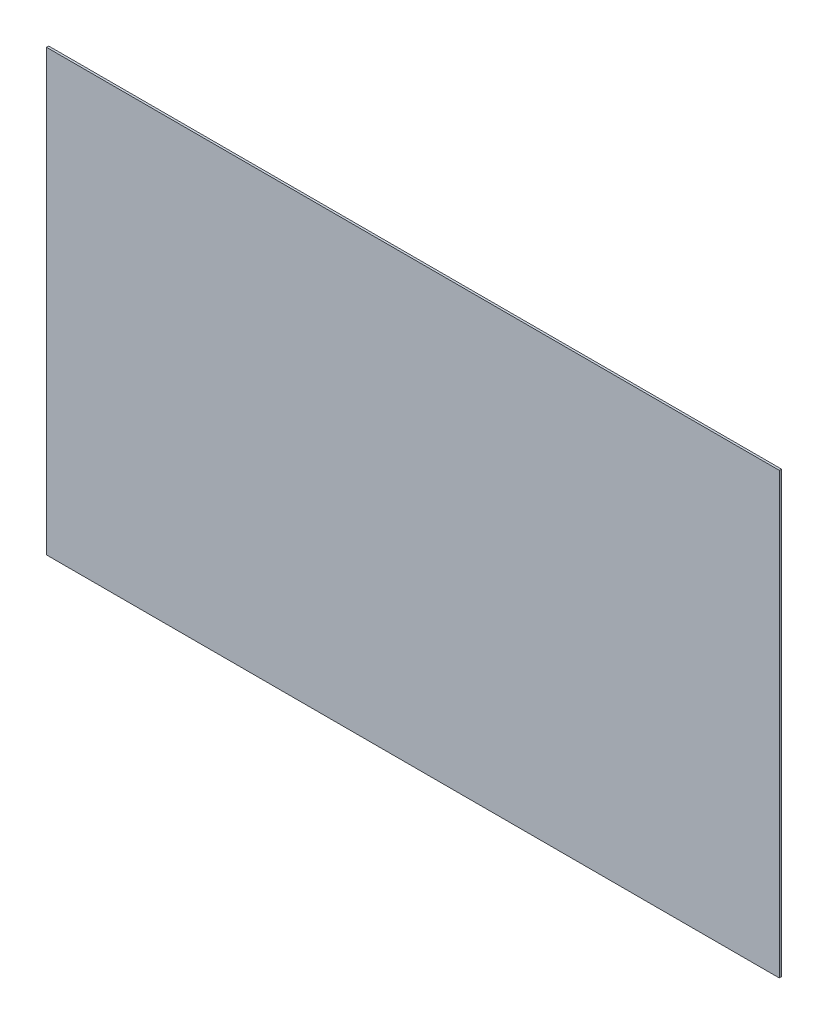
ISO-10303-21;
HEADER;
FILE_DESCRIPTION(('STEP AP214'),'2;1');
FILE_NAME('part.step','',(''),(''),'','','');
FILE_SCHEMA(('AUTOMOTIVE_DESIGN { 1 0 10303 214 1 1 1 1 }'));
ENDSEC;
DATA;
#1=APPLICATION_CONTEXT('core data for automotive mechanical design processes');
#2=APPLICATION_PROTOCOL_DEFINITION('international standard','automotive_design',2000,#1);
#3=PRODUCT_CONTEXT('',#1,'mechanical');
#4=PRODUCT('Part','Part','',(#3));
#5=PRODUCT_RELATED_PRODUCT_CATEGORY('part','',(#4));
#6=PRODUCT_DEFINITION_FORMATION('','',#4);
#7=PRODUCT_DEFINITION_CONTEXT('part definition',#1,'design');
#8=PRODUCT_DEFINITION('design','',#6,#7);
#9=PRODUCT_DEFINITION_SHAPE('','',#8);
#10=(LENGTH_UNIT() NAMED_UNIT(*) SI_UNIT(.MILLI.,.METRE.));
#11=(NAMED_UNIT(*) PLANE_ANGLE_UNIT() SI_UNIT($,.RADIAN.));
#12=(NAMED_UNIT(*) SI_UNIT($,.STERADIAN.) SOLID_ANGLE_UNIT());
#13=UNCERTAINTY_MEASURE_WITH_UNIT(LENGTH_MEASURE(1.E-05),#10,'distance_accuracy_value','');
#14=(GEOMETRIC_REPRESENTATION_CONTEXT(3) GLOBAL_UNCERTAINTY_ASSIGNED_CONTEXT((#13)) GLOBAL_UNIT_ASSIGNED_CONTEXT((#10,
#11,#12)) REPRESENTATION_CONTEXT('',''));
#15=CARTESIAN_POINT('',(0.,0.,0.));
#16=DIRECTION('',(0.,0.,1.));
#17=DIRECTION('',(1.,0.,0.));
#18=AXIS2_PLACEMENT_3D('',#15,#16,#17);
#19=CARTESIAN_POINT('',(0.,0.,3.));
#20=DIRECTION('',(1.,0.,0.));
#21=DIRECTION('',(0.,1.,0.));
#22=AXIS2_PLACEMENT_3D('',#19,#20,#21);
#23=PLANE('',#22);
#24=DIRECTION('',(0.,-1.,0.));
#25=VECTOR('',#24,1.);
#26=CARTESIAN_POINT('',(0.,0.,0.));
#27=LINE('',#26,#25);
#28=CARTESIAN_POINT('',(1.11022302462516E-13,600.,0.));
#29=VERTEX_POINT('',#28);
#30=CARTESIAN_POINT('',(0.,0.,0.));
#31=VERTEX_POINT('',#30);
#32=EDGE_CURVE('E104',#29,#31,#27,.T.);
#33=ORIENTED_EDGE('',*,*,#32,.T.);
#34=DIRECTION('',(0.,0.,-1.));
#35=VECTOR('',#34,1.);
#36=CARTESIAN_POINT('',(0.,0.,3.));
#37=LINE('',#36,#35);
#38=CARTESIAN_POINT('',(0.,0.,3.));
#39=VERTEX_POINT('',#38);
#40=EDGE_CURVE('E11',#39,#31,#37,.T.);
#41=ORIENTED_EDGE('',*,*,#40,.F.);
#42=DIRECTION('',(0.,-1.,0.));
#43=VECTOR('',#42,1.);
#44=CARTESIAN_POINT('',(0.,0.,3.));
#45=LINE('',#44,#43);
#46=CARTESIAN_POINT('',(1.11022302462516E-13,600.,3.));
#47=VERTEX_POINT('',#46);
#48=EDGE_CURVE('E92',#47,#39,#45,.T.);
#49=ORIENTED_EDGE('',*,*,#48,.F.);
#50=DIRECTION('',(0.,0.,-1.));
#51=VECTOR('',#50,1.);
#52=CARTESIAN_POINT('',(1.11022302462516E-13,600.,3.));
#53=LINE('',#52,#51);
#54=EDGE_CURVE('E100',#47,#29,#53,.T.);
#55=ORIENTED_EDGE('',*,*,#54,.T.);
#56=EDGE_LOOP('',(#33,#41,#49,#55));
#57=FACE_BOUND('',#56,.T.);
#58=ADVANCED_FACE('F41',(#57),#23,.F.);
#59=CARTESIAN_POINT('',(0.,0.,3.));
#60=DIRECTION('',(0.,1.,0.));
#61=DIRECTION('',(0.,0.,1.));
#62=AXIS2_PLACEMENT_3D('',#59,#60,#61);
#63=PLANE('',#62);
#64=DIRECTION('',(1.,0.,0.));
#65=VECTOR('',#64,1.);
#66=CARTESIAN_POINT('',(0.,0.,0.));
#67=LINE('',#66,#65);
#68=CARTESIAN_POINT('',(1000.,0.,0.));
#69=VERTEX_POINT('',#68);
#70=EDGE_CURVE('E96',#31,#69,#67,.T.);
#71=ORIENTED_EDGE('',*,*,#70,.T.);
#72=DIRECTION('',(0.,0.,-1.));
#73=VECTOR('',#72,1.);
#74=CARTESIAN_POINT('',(1000.,0.,3.));
#75=LINE('',#74,#73);
#76=CARTESIAN_POINT('',(1000.,0.,3.));
#77=VERTEX_POINT('',#76);
#78=EDGE_CURVE('E49',#77,#69,#75,.T.);
#79=ORIENTED_EDGE('',*,*,#78,.F.);
#80=DIRECTION('',(1.,0.,0.));
#81=VECTOR('',#80,1.);
#82=CARTESIAN_POINT('',(0.,0.,3.));
#83=LINE('',#82,#81);
#84=EDGE_CURVE('E87',#39,#77,#83,.T.);
#85=ORIENTED_EDGE('',*,*,#84,.F.);
#86=ORIENTED_EDGE('',*,*,#40,.T.);
#87=EDGE_LOOP('',(#71,#79,#85,#86));
#88=FACE_BOUND('',#87,.T.);
#89=ADVANCED_FACE('F95',(#88),#63,.F.);
#90=CARTESIAN_POINT('',(1000.,0.,3.));
#91=DIRECTION('',(-1.,0.,0.));
#92=DIRECTION('',(0.,0.,1.));
#93=AXIS2_PLACEMENT_3D('',#90,#91,#92);
#94=PLANE('',#93);
#95=DIRECTION('',(0.,1.,0.));
#96=VECTOR('',#95,1.);
#97=CARTESIAN_POINT('',(1000.,0.,0.));
#98=LINE('',#97,#96);
#99=CARTESIAN_POINT('',(1000.,600.,0.));
#100=VERTEX_POINT('',#99);
#101=EDGE_CURVE('E74',#69,#100,#98,.T.);
#102=ORIENTED_EDGE('',*,*,#101,.T.);
#103=DIRECTION('',(0.,0.,-1.));
#104=VECTOR('',#103,1.);
#105=CARTESIAN_POINT('',(1000.,600.,3.));
#106=LINE('',#105,#104);
#107=CARTESIAN_POINT('',(1000.,600.,3.));
#108=VERTEX_POINT('',#107);
#109=EDGE_CURVE('E97',#108,#100,#106,.T.);
#110=ORIENTED_EDGE('',*,*,#109,.F.);
#111=DIRECTION('',(0.,1.,0.));
#112=VECTOR('',#111,1.);
#113=CARTESIAN_POINT('',(1000.,0.,3.));
#114=LINE('',#113,#112);
#115=EDGE_CURVE('E90',#77,#108,#114,.T.);
#116=ORIENTED_EDGE('',*,*,#115,.F.);
#117=ORIENTED_EDGE('',*,*,#78,.T.);
#118=EDGE_LOOP('',(#102,#110,#116,#117));
#119=FACE_BOUND('',#118,.T.);
#120=ADVANCED_FACE('F98',(#119),#94,.F.);
#121=CARTESIAN_POINT('',(1.11022302462516E-13,600.,3.));
#122=DIRECTION('',(0.,-1.,0.));
#123=DIRECTION('',(0.,0.,-1.));
#124=AXIS2_PLACEMENT_3D('',#121,#122,#123);
#125=PLANE('',#124);
#126=DIRECTION('',(-1.,0.,0.));
#127=VECTOR('',#126,1.);
#128=CARTESIAN_POINT('',(1.11022302462516E-13,600.,0.));
#129=LINE('',#128,#127);
#130=EDGE_CURVE('E80',#100,#29,#129,.T.);
#131=ORIENTED_EDGE('',*,*,#130,.T.);
#132=ORIENTED_EDGE('',*,*,#54,.F.);
#133=DIRECTION('',(-1.,0.,0.));
#134=VECTOR('',#133,1.);
#135=CARTESIAN_POINT('',(1.11022302462516E-13,600.,3.));
#136=LINE('',#135,#134);
#137=EDGE_CURVE('E57',#108,#47,#136,.T.);
#138=ORIENTED_EDGE('',*,*,#137,.F.);
#139=ORIENTED_EDGE('',*,*,#109,.T.);
#140=EDGE_LOOP('',(#131,#132,#138,#139));
#141=FACE_BOUND('',#140,.T.);
#142=ADVANCED_FACE('F111',(#141),#125,.F.);
#143=CARTESIAN_POINT('',(0.,0.,3.));
#144=DIRECTION('',(0.,0.,-1.));
#145=DIRECTION('',(-1.,0.,0.));
#146=AXIS2_PLACEMENT_3D('',#143,#144,#145);
#147=PLANE('',#146);
#148=ORIENTED_EDGE('',*,*,#48,.T.);
#149=ORIENTED_EDGE('',*,*,#84,.T.);
#150=ORIENTED_EDGE('',*,*,#115,.T.);
#151=ORIENTED_EDGE('',*,*,#137,.T.);
#152=EDGE_LOOP('',(#148,#149,#150,#151));
#153=FACE_BOUND('',#152,.T.);
#154=ADVANCED_FACE('F88',(#153),#147,.F.);
#155=CARTESIAN_POINT('',(0.,0.,0.));
#156=DIRECTION('',(0.,0.,-1.));
#157=DIRECTION('',(-1.,0.,0.));
#158=AXIS2_PLACEMENT_3D('',#155,#156,#157);
#159=PLANE('',#158);
#160=ORIENTED_EDGE('',*,*,#32,.F.);
#161=ORIENTED_EDGE('',*,*,#130,.F.);
#162=ORIENTED_EDGE('',*,*,#101,.F.);
#163=ORIENTED_EDGE('',*,*,#70,.F.);
#164=EDGE_LOOP('',(#160,#161,#162,#163));
#165=FACE_BOUND('',#164,.T.);
#166=ADVANCED_FACE('F114',(#165),#159,.T.);
#167=CLOSED_SHELL('',(#58,#89,#120,#142,#154,#166));
#168=MANIFOLD_SOLID_BREP('B2',#167);
#169=ADVANCED_BREP_SHAPE_REPRESENTATION('',(#18,#168),#14);
#170=SHAPE_DEFINITION_REPRESENTATION(#9,#169);
ENDSEC;
END-ISO-10303-21;
